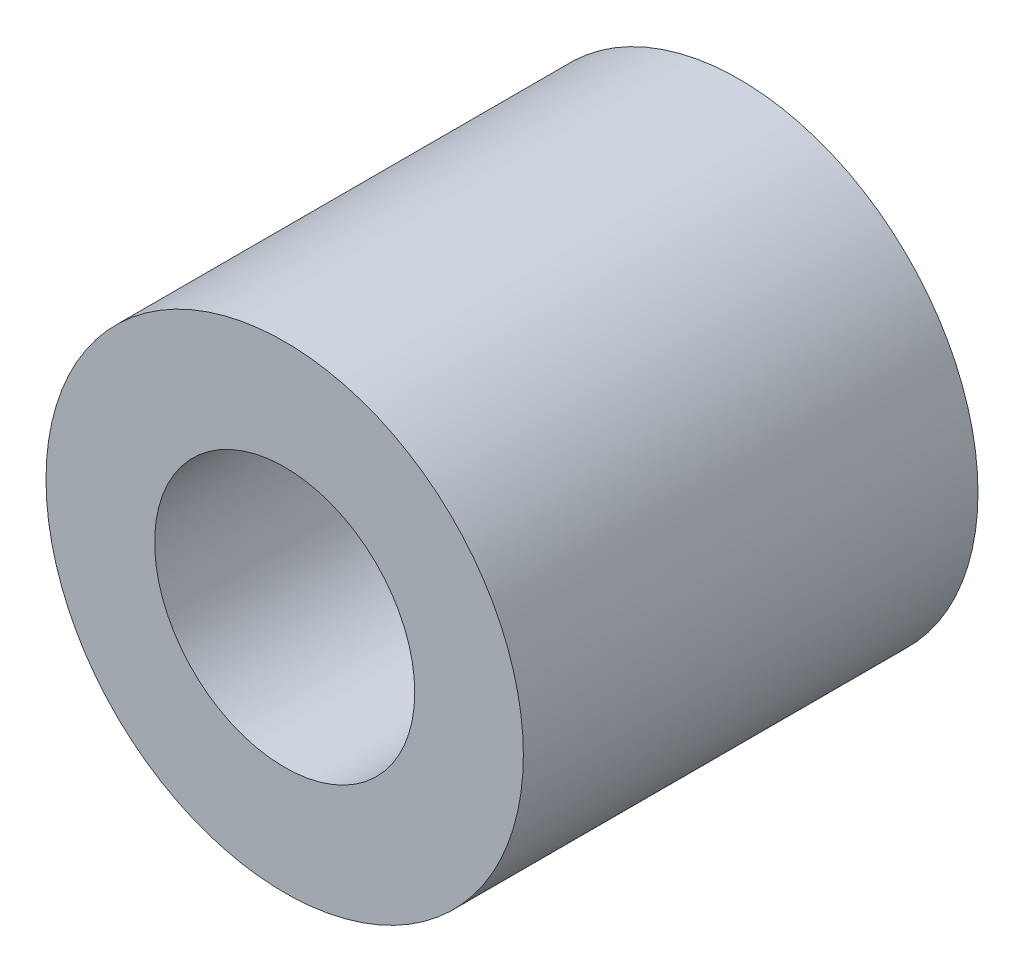
ISO-10303-21;
HEADER;
FILE_DESCRIPTION(('STEP AP214'),'2;1');
FILE_NAME('part.step','',(''),(''),'','','');
FILE_SCHEMA(('AUTOMOTIVE_DESIGN { 1 0 10303 214 1 1 1 1 }'));
ENDSEC;
DATA;
#1=APPLICATION_CONTEXT('core data for automotive mechanical design processes');
#2=APPLICATION_PROTOCOL_DEFINITION('international standard','automotive_design',2000,#1);
#3=PRODUCT_CONTEXT('',#1,'mechanical');
#4=PRODUCT('Part','Part','',(#3));
#5=PRODUCT_RELATED_PRODUCT_CATEGORY('part','',(#4));
#6=PRODUCT_DEFINITION_FORMATION('','',#4);
#7=PRODUCT_DEFINITION_CONTEXT('part definition',#1,'design');
#8=PRODUCT_DEFINITION('design','',#6,#7);
#9=PRODUCT_DEFINITION_SHAPE('','',#8);
#10=(LENGTH_UNIT() NAMED_UNIT(*) SI_UNIT(.MILLI.,.METRE.));
#11=(NAMED_UNIT(*) PLANE_ANGLE_UNIT() SI_UNIT($,.RADIAN.));
#12=(NAMED_UNIT(*) SI_UNIT($,.STERADIAN.) SOLID_ANGLE_UNIT());
#13=UNCERTAINTY_MEASURE_WITH_UNIT(LENGTH_MEASURE(1.E-05),#10,'distance_accuracy_value','');
#14=(GEOMETRIC_REPRESENTATION_CONTEXT(3) GLOBAL_UNCERTAINTY_ASSIGNED_CONTEXT((#13)) GLOBAL_UNIT_ASSIGNED_CONTEXT((#10,
#11,#12)) REPRESENTATION_CONTEXT('',''));
#15=CARTESIAN_POINT('',(0.,0.,0.));
#16=DIRECTION('',(0.,0.,1.));
#17=DIRECTION('',(1.,0.,0.));
#18=AXIS2_PLACEMENT_3D('',#15,#16,#17);
#19=CARTESIAN_POINT('',(0.,0.,18.));
#20=DIRECTION('',(0.,0.,1.));
#21=DIRECTION('',(1.,0.,0.));
#22=AXIS2_PLACEMENT_3D('',#19,#20,#21);
#23=PLANE('',#22);
#24=CARTESIAN_POINT('',(0.,0.,18.));
#25=DIRECTION('',(0.,0.,1.));
#26=DIRECTION('',(1.,0.,0.));
#27=AXIS2_PLACEMENT_3D('',#24,#25,#26);
#28=CIRCLE('',#27,9.45);
#29=CARTESIAN_POINT('',(9.45,0.,18.));
#30=VERTEX_POINT('',#29);
#31=EDGE_CURVE('E10',#30,#30,#28,.T.);
#32=ORIENTED_EDGE('',*,*,#31,.T.);
#33=EDGE_LOOP('',(#32));
#34=FACE_BOUND('',#33,.T.);
#35=CARTESIAN_POINT('',(0.,0.,18.));
#36=DIRECTION('',(0.,0.,1.));
#37=DIRECTION('',(1.,0.,0.));
#38=AXIS2_PLACEMENT_3D('',#35,#36,#37);
#39=CIRCLE('',#38,5.15);
#40=CARTESIAN_POINT('',(5.15,0.,18.));
#41=VERTEX_POINT('',#40);
#42=EDGE_CURVE('E42',#41,#41,#39,.T.);
#43=ORIENTED_EDGE('',*,*,#42,.F.);
#44=EDGE_LOOP('',(#43));
#45=FACE_BOUND('',#44,.T.);
#46=ADVANCED_FACE('F31',(#34,#45),#23,.T.);
#47=CARTESIAN_POINT('',(0.,0.,0.));
#48=DIRECTION('',(0.,0.,1.));
#49=DIRECTION('',(1.,0.,0.));
#50=AXIS2_PLACEMENT_3D('',#47,#48,#49);
#51=PLANE('',#50);
#52=CARTESIAN_POINT('',(0.,0.,0.));
#53=DIRECTION('',(0.,0.,1.));
#54=DIRECTION('',(1.,0.,0.));
#55=AXIS2_PLACEMENT_3D('',#52,#53,#54);
#56=CIRCLE('',#55,9.45);
#57=CARTESIAN_POINT('',(9.45,0.,0.));
#58=VERTEX_POINT('',#57);
#59=EDGE_CURVE('E35',#58,#58,#56,.T.);
#60=ORIENTED_EDGE('',*,*,#59,.F.);
#61=EDGE_LOOP('',(#60));
#62=FACE_BOUND('',#61,.T.);
#63=CARTESIAN_POINT('',(0.,0.,0.));
#64=DIRECTION('',(0.,0.,1.));
#65=DIRECTION('',(1.,0.,0.));
#66=AXIS2_PLACEMENT_3D('',#63,#64,#65);
#67=CIRCLE('',#66,5.15);
#68=CARTESIAN_POINT('',(5.15,0.,0.));
#69=VERTEX_POINT('',#68);
#70=EDGE_CURVE('E44',#69,#69,#67,.T.);
#71=ORIENTED_EDGE('',*,*,#70,.T.);
#72=EDGE_LOOP('',(#71));
#73=FACE_BOUND('',#72,.T.);
#74=ADVANCED_FACE('F54',(#62,#73),#51,.F.);
#75=CARTESIAN_POINT('',(0.,0.,18.));
#76=DIRECTION('',(0.,0.,-1.));
#77=DIRECTION('',(-1.,0.,0.));
#78=AXIS2_PLACEMENT_3D('',#75,#76,#77);
#79=CYLINDRICAL_SURFACE('',#78,9.45);
#80=ORIENTED_EDGE('',*,*,#31,.F.);
#81=EDGE_LOOP('',(#80));
#82=FACE_BOUND('',#81,.T.);
#83=ORIENTED_EDGE('',*,*,#59,.T.);
#84=EDGE_LOOP('',(#83));
#85=FACE_BOUND('',#84,.T.);
#86=ADVANCED_FACE('F33',(#82,#85),#79,.T.);
#87=CARTESIAN_POINT('',(0.,0.,18.));
#88=DIRECTION('',(0.,0.,-1.));
#89=DIRECTION('',(-1.,0.,0.));
#90=AXIS2_PLACEMENT_3D('',#87,#88,#89);
#91=CYLINDRICAL_SURFACE('',#90,5.15);
#92=ORIENTED_EDGE('',*,*,#42,.T.);
#93=EDGE_LOOP('',(#92));
#94=FACE_BOUND('',#93,.T.);
#95=ORIENTED_EDGE('',*,*,#70,.F.);
#96=EDGE_LOOP('',(#95));
#97=FACE_BOUND('',#96,.T.);
#98=ADVANCED_FACE('F50',(#94,#97),#91,.F.);
#99=CLOSED_SHELL('',(#46,#74,#86,#98));
#100=MANIFOLD_SOLID_BREP('B2',#99);
#101=ADVANCED_BREP_SHAPE_REPRESENTATION('',(#18,#100),#14);
#102=SHAPE_DEFINITION_REPRESENTATION(#9,#101);
ENDSEC;
END-ISO-10303-21;
